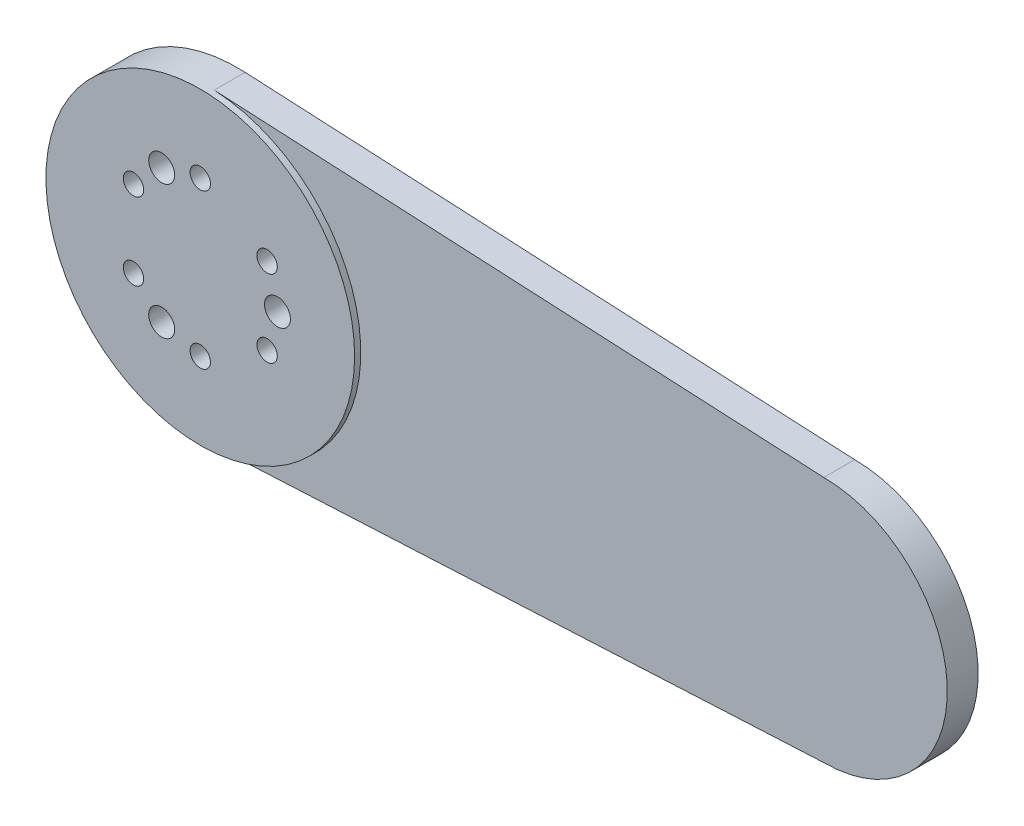
ISO-10303-21;
HEADER;
FILE_DESCRIPTION(('STEP AP214'),'2;1');
FILE_NAME('part.step','',(''),(''),'','','');
FILE_SCHEMA(('AUTOMOTIVE_DESIGN { 1 0 10303 214 1 1 1 1 }'));
ENDSEC;
DATA;
#1=APPLICATION_CONTEXT('core data for automotive mechanical design processes');
#2=APPLICATION_PROTOCOL_DEFINITION('international standard','automotive_design',2000,#1);
#3=PRODUCT_CONTEXT('',#1,'mechanical');
#4=PRODUCT('Part','Part','',(#3));
#5=PRODUCT_RELATED_PRODUCT_CATEGORY('part','',(#4));
#6=PRODUCT_DEFINITION_FORMATION('','',#4);
#7=PRODUCT_DEFINITION_CONTEXT('part definition',#1,'design');
#8=PRODUCT_DEFINITION('design','',#6,#7);
#9=PRODUCT_DEFINITION_SHAPE('','',#8);
#10=(LENGTH_UNIT() NAMED_UNIT(*) SI_UNIT(.MILLI.,.METRE.));
#11=(NAMED_UNIT(*) PLANE_ANGLE_UNIT() SI_UNIT($,.RADIAN.));
#12=(NAMED_UNIT(*) SI_UNIT($,.STERADIAN.) SOLID_ANGLE_UNIT());
#13=UNCERTAINTY_MEASURE_WITH_UNIT(LENGTH_MEASURE(1.E-05),#10,'distance_accuracy_value','');
#14=(GEOMETRIC_REPRESENTATION_CONTEXT(3) GLOBAL_UNCERTAINTY_ASSIGNED_CONTEXT((#13)) GLOBAL_UNIT_ASSIGNED_CONTEXT((#10,
#11,#12)) REPRESENTATION_CONTEXT('',''));
#15=CARTESIAN_POINT('',(0.,0.,0.));
#16=DIRECTION('',(0.,0.,1.));
#17=DIRECTION('',(1.,0.,0.));
#18=AXIS2_PLACEMENT_3D('',#15,#16,#17);
#19=CARTESIAN_POINT('',(100.,0.,3.));
#20=DIRECTION('',(0.,0.,-1.));
#21=DIRECTION('',(-1.,0.,0.));
#22=AXIS2_PLACEMENT_3D('',#19,#20,#21);
#23=CYLINDRICAL_SURFACE('',#22,20.);
#24=CARTESIAN_POINT('',(100.,0.,2.));
#25=DIRECTION('',(0.,0.,1.));
#26=DIRECTION('',(1.,0.,0.));
#27=AXIS2_PLACEMENT_3D('',#24,#25,#26);
#28=CIRCLE('',#27,20.);
#29=CARTESIAN_POINT('',(100.,-20.,2.));
#30=VERTEX_POINT('',#29);
#31=CARTESIAN_POINT('',(100.,20.,2.));
#32=VERTEX_POINT('',#31);
#33=EDGE_CURVE('E179',#30,#32,#28,.T.);
#34=ORIENTED_EDGE('',*,*,#33,.F.);
#35=DIRECTION('',(0.,0.,-1.));
#36=VECTOR('',#35,1.);
#37=CARTESIAN_POINT('',(100.,-20.,3.));
#38=LINE('',#37,#36);
#39=CARTESIAN_POINT('',(100.,-20.,-3.));
#40=VERTEX_POINT('',#39);
#41=EDGE_CURVE('E261',#30,#40,#38,.T.);
#42=ORIENTED_EDGE('',*,*,#41,.T.);
#43=CARTESIAN_POINT('',(100.,0.,-3.));
#44=DIRECTION('',(0.,0.,-1.));
#45=DIRECTION('',(-1.,0.,0.));
#46=AXIS2_PLACEMENT_3D('',#43,#44,#45);
#47=CIRCLE('',#46,20.);
#48=CARTESIAN_POINT('',(100.,20.,-3.));
#49=VERTEX_POINT('',#48);
#50=EDGE_CURVE('E282',#49,#40,#47,.T.);
#51=ORIENTED_EDGE('',*,*,#50,.F.);
#52=DIRECTION('',(0.,0.,-1.));
#53=VECTOR('',#52,1.);
#54=CARTESIAN_POINT('',(100.,20.,3.));
#55=LINE('',#54,#53);
#56=EDGE_CURVE('E79',#32,#49,#55,.T.);
#57=ORIENTED_EDGE('',*,*,#56,.F.);
#58=EDGE_LOOP('',(#34,#42,#51,#57));
#59=FACE_BOUND('',#58,.T.);
#60=ADVANCED_FACE('F71',(#59),#23,.T.);
#61=CARTESIAN_POINT('',(100.,20.,3.));
#62=DIRECTION('',(-0.0502526929491808,-0.998736535254096,0.));
#63=DIRECTION('',(0.998736535254096,-0.0502526929491808,0.));
#64=AXIS2_PLACEMENT_3D('',#61,#62,#63);
#65=PLANE('',#64);
#66=DIRECTION('',(-0.998736535254096,0.0502526929491808,0.));
#67=VECTOR('',#66,1.);
#68=CARTESIAN_POINT('',(100.,20.,2.));
#69=LINE('',#68,#67);
#70=CARTESIAN_POINT('',(1.25631732372952,24.9684133813524,2.));
#71=VERTEX_POINT('',#70);
#72=EDGE_CURVE('E182',#32,#71,#69,.T.);
#73=ORIENTED_EDGE('',*,*,#72,.F.);
#74=ORIENTED_EDGE('',*,*,#56,.T.);
#75=DIRECTION('',(0.998736535254096,-0.0502526929491808,0.));
#76=VECTOR('',#75,1.);
#77=CARTESIAN_POINT('',(1.25631732372951,24.9684133813524,-3.));
#78=LINE('',#77,#76);
#79=CARTESIAN_POINT('',(1.25631732372951,24.9684133813524,-3.));
#80=VERTEX_POINT('',#79);
#81=EDGE_CURVE('E278',#80,#49,#78,.T.);
#82=ORIENTED_EDGE('',*,*,#81,.F.);
#83=DIRECTION('',(0.,0.,-1.));
#84=VECTOR('',#83,1.);
#85=CARTESIAN_POINT('',(1.25631732372952,24.9684133813524,3.));
#86=LINE('',#85,#84);
#87=EDGE_CURVE('E267',#71,#80,#86,.T.);
#88=ORIENTED_EDGE('',*,*,#87,.F.);
#89=EDGE_LOOP('',(#73,#74,#82,#88));
#90=FACE_BOUND('',#89,.T.);
#91=ADVANCED_FACE('F275',(#90),#65,.F.);
#92=CARTESIAN_POINT('',(100.,-20.,3.));
#93=DIRECTION('',(-0.0502526929491809,0.998736535254096,0.));
#94=DIRECTION('',(-0.998736535254096,-0.0502526929491809,0.));
#95=AXIS2_PLACEMENT_3D('',#92,#93,#94);
#96=PLANE('',#95);
#97=DIRECTION('',(0.998736535254096,0.0502526929491809,0.));
#98=VECTOR('',#97,1.);
#99=CARTESIAN_POINT('',(100.,-20.,2.));
#100=LINE('',#99,#98);
#101=CARTESIAN_POINT('',(1.25631732372951,-24.9684133813524,2.));
#102=VERTEX_POINT('',#101);
#103=EDGE_CURVE('E12',#102,#30,#100,.T.);
#104=ORIENTED_EDGE('',*,*,#103,.F.);
#105=DIRECTION('',(0.,0.,-1.));
#106=VECTOR('',#105,1.);
#107=CARTESIAN_POINT('',(1.25631732372951,-24.9684133813524,3.));
#108=LINE('',#107,#106);
#109=CARTESIAN_POINT('',(1.25631732372951,-24.9684133813524,-3.));
#110=VERTEX_POINT('',#109);
#111=EDGE_CURVE('E264',#102,#110,#108,.T.);
#112=ORIENTED_EDGE('',*,*,#111,.T.);
#113=DIRECTION('',(-0.998736535254096,-0.0502526929491808,0.));
#114=VECTOR('',#113,1.);
#115=CARTESIAN_POINT('',(100.,-20.,-3.));
#116=LINE('',#115,#114);
#117=EDGE_CURVE('E288',#40,#110,#116,.T.);
#118=ORIENTED_EDGE('',*,*,#117,.F.);
#119=ORIENTED_EDGE('',*,*,#41,.F.);
#120=EDGE_LOOP('',(#104,#112,#118,#119));
#121=FACE_BOUND('',#120,.T.);
#122=ADVANCED_FACE('F316',(#121),#96,.F.);
#123=CARTESIAN_POINT('',(100.,0.,3.));
#124=DIRECTION('',(0.,0.,1.));
#125=DIRECTION('',(1.,0.,0.));
#126=AXIS2_PLACEMENT_3D('',#123,#124,#125);
#127=PLANE('',#126);
#128=CARTESIAN_POINT('',(0.,0.,3.));
#129=DIRECTION('',(0.,0.,1.));
#130=DIRECTION('',(1.,0.,0.));
#131=AXIS2_PLACEMENT_3D('',#128,#129,#130);
#132=CIRCLE('',#131,25.);
#133=CARTESIAN_POINT('',(25.,0.,3.));
#134=VERTEX_POINT('',#133);
#135=EDGE_CURVE('E254',#134,#134,#132,.T.);
#136=ORIENTED_EDGE('',*,*,#135,.T.);
#137=EDGE_LOOP('',(#136));
#138=FACE_BOUND('',#137,.T.);
#139=CARTESIAN_POINT('',(-6.25000000000005,-10.8253175473055,3.));
#140=DIRECTION('',(0.,0.,1.));
#141=DIRECTION('',(1.,0.,0.));
#142=AXIS2_PLACEMENT_3D('',#139,#140,#141);
#143=CIRCLE('',#142,2.1);
#144=CARTESIAN_POINT('',(-4.15000000000005,-10.8253175473055,3.));
#145=VERTEX_POINT('',#144);
#146=EDGE_CURVE('E194',#145,#145,#143,.T.);
#147=ORIENTED_EDGE('',*,*,#146,.F.);
#148=EDGE_LOOP('',(#147));
#149=FACE_BOUND('',#148,.T.);
#150=CARTESIAN_POINT('',(-10.8253175473055,-6.2499999999999,3.));
#151=DIRECTION('',(0.,0.,1.));
#152=DIRECTION('',(1.,0.,0.));
#153=AXIS2_PLACEMENT_3D('',#150,#151,#152);
#154=CIRCLE('',#153,1.65);
#155=CARTESIAN_POINT('',(-9.17531754730555,-6.2499999999999,3.));
#156=VERTEX_POINT('',#155);
#157=EDGE_CURVE('E210',#156,#156,#154,.T.);
#158=ORIENTED_EDGE('',*,*,#157,.F.);
#159=EDGE_LOOP('',(#158));
#160=FACE_BOUND('',#159,.T.);
#161=CARTESIAN_POINT('',(10.8253175473055,-6.25000000000005,3.));
#162=DIRECTION('',(0.,0.,1.));
#163=DIRECTION('',(1.,0.,0.));
#164=AXIS2_PLACEMENT_3D('',#161,#162,#163);
#165=CIRCLE('',#164,1.65);
#166=CARTESIAN_POINT('',(12.4753175473055,-6.25000000000005,3.));
#167=VERTEX_POINT('',#166);
#168=EDGE_CURVE('E226',#167,#167,#165,.T.);
#169=ORIENTED_EDGE('',*,*,#168,.F.);
#170=EDGE_LOOP('',(#169));
#171=FACE_BOUND('',#170,.T.);
#172=CARTESIAN_POINT('',(12.5,0.,3.));
#173=DIRECTION('',(0.,0.,1.));
#174=DIRECTION('',(1.,0.,0.));
#175=AXIS2_PLACEMENT_3D('',#172,#173,#174);
#176=CIRCLE('',#175,2.1);
#177=CARTESIAN_POINT('',(14.6,0.,3.));
#178=VERTEX_POINT('',#177);
#179=EDGE_CURVE('E242',#178,#178,#176,.T.);
#180=ORIENTED_EDGE('',*,*,#179,.F.);
#181=EDGE_LOOP('',(#180));
#182=FACE_BOUND('',#181,.T.);
#183=CARTESIAN_POINT('',(0.,12.5,3.));
#184=DIRECTION('',(0.,0.,1.));
#185=DIRECTION('',(1.,0.,0.));
#186=AXIS2_PLACEMENT_3D('',#183,#184,#185);
#187=CIRCLE('',#186,1.65);
#188=CARTESIAN_POINT('',(1.65,12.5,3.));
#189=VERTEX_POINT('',#188);
#190=EDGE_CURVE('E250',#189,#189,#187,.T.);
#191=ORIENTED_EDGE('',*,*,#190,.F.);
#192=EDGE_LOOP('',(#191));
#193=FACE_BOUND('',#192,.T.);
#194=CARTESIAN_POINT('',(10.8253175473055,6.24999999999998,3.));
#195=DIRECTION('',(0.,0.,1.));
#196=DIRECTION('',(1.,0.,0.));
#197=AXIS2_PLACEMENT_3D('',#194,#195,#196);
#198=CIRCLE('',#197,1.65);
#199=CARTESIAN_POINT('',(12.4753175473055,6.24999999999998,3.));
#200=VERTEX_POINT('',#199);
#201=EDGE_CURVE('E234',#200,#200,#198,.T.);
#202=ORIENTED_EDGE('',*,*,#201,.F.);
#203=EDGE_LOOP('',(#202));
#204=FACE_BOUND('',#203,.T.);
#205=CARTESIAN_POINT('',(0.,-12.5,3.));
#206=DIRECTION('',(0.,0.,1.));
#207=DIRECTION('',(1.,0.,0.));
#208=AXIS2_PLACEMENT_3D('',#205,#206,#207);
#209=CIRCLE('',#208,1.65);
#210=CARTESIAN_POINT('',(1.64999999999991,-12.5,3.));
#211=VERTEX_POINT('',#210);
#212=EDGE_CURVE('E218',#211,#211,#209,.T.);
#213=ORIENTED_EDGE('',*,*,#212,.F.);
#214=EDGE_LOOP('',(#213));
#215=FACE_BOUND('',#214,.T.);
#216=CARTESIAN_POINT('',(-10.8253175473054,6.25000000000013,3.));
#217=DIRECTION('',(0.,0.,1.));
#218=DIRECTION('',(1.,0.,0.));
#219=AXIS2_PLACEMENT_3D('',#216,#217,#218);
#220=CIRCLE('',#219,1.65);
#221=CARTESIAN_POINT('',(-9.17531754730541,6.25000000000013,3.));
#222=VERTEX_POINT('',#221);
#223=EDGE_CURVE('E202',#222,#222,#220,.T.);
#224=ORIENTED_EDGE('',*,*,#223,.F.);
#225=EDGE_LOOP('',(#224));
#226=FACE_BOUND('',#225,.T.);
#227=CARTESIAN_POINT('',(-6.2499999999999,10.8253175473055,3.));
#228=DIRECTION('',(0.,0.,1.));
#229=DIRECTION('',(1.,0.,0.));
#230=AXIS2_PLACEMENT_3D('',#227,#228,#229);
#231=CIRCLE('',#230,2.1);
#232=CARTESIAN_POINT('',(-4.1499999999999,10.8253175473055,3.));
#233=VERTEX_POINT('',#232);
#234=EDGE_CURVE('E186',#233,#233,#231,.T.);
#235=ORIENTED_EDGE('',*,*,#234,.F.);
#236=EDGE_LOOP('',(#235));
#237=FACE_BOUND('',#236,.T.);
#238=ADVANCED_FACE('F337',(#138,#149,#160,#171,#182,#193,#204,#215,#226,#237),#127,.T.);
#239=CARTESIAN_POINT('',(100.,0.,0.));
#240=DIRECTION('',(0.,0.,1.));
#241=DIRECTION('',(1.,0.,0.));
#242=AXIS2_PLACEMENT_3D('',#239,#240,#241);
#243=PLANE('',#242);
#244=DIRECTION('',(0.998736535254096,-0.0502526929491808,0.));
#245=VECTOR('',#244,1.);
#246=CARTESIAN_POINT('',(1.10555924488198,21.9722037755901,0.));
#247=LINE('',#246,#245);
#248=CARTESIAN_POINT('',(1.10555924488198,21.9722037755901,0.));
#249=VERTEX_POINT('',#248);
#250=CARTESIAN_POINT('',(99.927634419751,16.9998459764433,0.));
#251=VERTEX_POINT('',#250);
#252=EDGE_CURVE('E167',#249,#251,#247,.T.);
#253=ORIENTED_EDGE('',*,*,#252,.T.);
#254=CARTESIAN_POINT('',(100.,0.,0.));
#255=DIRECTION('',(0.,0.,-1.));
#256=DIRECTION('',(-1.,0.,0.));
#257=AXIS2_PLACEMENT_3D('',#254,#255,#256);
#258=CIRCLE('',#257,17.);
#259=CARTESIAN_POINT('',(99.927634419751,-16.9998459764433,0.));
#260=VERTEX_POINT('',#259);
#261=EDGE_CURVE('E142',#251,#260,#258,.T.);
#262=ORIENTED_EDGE('',*,*,#261,.T.);
#263=DIRECTION('',(-0.998736535254096,-0.0502526929491808,0.));
#264=VECTOR('',#263,1.);
#265=CARTESIAN_POINT('',(1.10555924488198,-21.9722037755901,0.));
#266=LINE('',#265,#264);
#267=CARTESIAN_POINT('',(1.10555924488195,-21.9722037755901,0.));
#268=VERTEX_POINT('',#267);
#269=EDGE_CURVE('E170',#260,#268,#266,.T.);
#270=ORIENTED_EDGE('',*,*,#269,.T.);
#271=CARTESIAN_POINT('',(0.,0.,0.));
#272=DIRECTION('',(0.,0.,-1.));
#273=DIRECTION('',(-1.,0.,0.));
#274=AXIS2_PLACEMENT_3D('',#271,#272,#273);
#275=CIRCLE('',#274,22.);
#276=EDGE_CURVE('E302',#268,#249,#275,.T.);
#277=ORIENTED_EDGE('',*,*,#276,.T.);
#278=EDGE_LOOP('',(#253,#262,#270,#277));
#279=FACE_BOUND('',#278,.T.);
#280=CARTESIAN_POINT('',(0.,12.5,0.));
#281=DIRECTION('',(0.,0.,1.));
#282=DIRECTION('',(1.,0.,0.));
#283=AXIS2_PLACEMENT_3D('',#280,#281,#282);
#284=CIRCLE('',#283,1.65);
#285=CARTESIAN_POINT('',(1.65,12.5,0.));
#286=VERTEX_POINT('',#285);
#287=EDGE_CURVE('E246',#286,#286,#284,.T.);
#288=ORIENTED_EDGE('',*,*,#287,.T.);
#289=EDGE_LOOP('',(#288));
#290=FACE_BOUND('',#289,.T.);
#291=CARTESIAN_POINT('',(12.5,0.,0.));
#292=DIRECTION('',(0.,0.,1.));
#293=DIRECTION('',(1.,0.,0.));
#294=AXIS2_PLACEMENT_3D('',#291,#292,#293);
#295=CIRCLE('',#294,2.1);
#296=CARTESIAN_POINT('',(14.6,0.,0.));
#297=VERTEX_POINT('',#296);
#298=EDGE_CURVE('E238',#297,#297,#295,.T.);
#299=ORIENTED_EDGE('',*,*,#298,.T.);
#300=EDGE_LOOP('',(#299));
#301=FACE_BOUND('',#300,.T.);
#302=CARTESIAN_POINT('',(10.8253175473055,6.24999999999998,0.));
#303=DIRECTION('',(0.,0.,1.));
#304=DIRECTION('',(1.,0.,0.));
#305=AXIS2_PLACEMENT_3D('',#302,#303,#304);
#306=CIRCLE('',#305,1.65);
#307=CARTESIAN_POINT('',(12.4753175473055,6.24999999999998,0.));
#308=VERTEX_POINT('',#307);
#309=EDGE_CURVE('E230',#308,#308,#306,.T.);
#310=ORIENTED_EDGE('',*,*,#309,.T.);
#311=EDGE_LOOP('',(#310));
#312=FACE_BOUND('',#311,.T.);
#313=CARTESIAN_POINT('',(10.8253175473055,-6.25000000000005,0.));
#314=DIRECTION('',(0.,0.,1.));
#315=DIRECTION('',(1.,0.,0.));
#316=AXIS2_PLACEMENT_3D('',#313,#314,#315);
#317=CIRCLE('',#316,1.65);
#318=CARTESIAN_POINT('',(12.4753175473055,-6.25000000000005,0.));
#319=VERTEX_POINT('',#318);
#320=EDGE_CURVE('E222',#319,#319,#317,.T.);
#321=ORIENTED_EDGE('',*,*,#320,.T.);
#322=EDGE_LOOP('',(#321));
#323=FACE_BOUND('',#322,.T.);
#324=CARTESIAN_POINT('',(0.,-12.5,0.));
#325=DIRECTION('',(0.,0.,1.));
#326=DIRECTION('',(1.,0.,0.));
#327=AXIS2_PLACEMENT_3D('',#324,#325,#326);
#328=CIRCLE('',#327,1.65);
#329=CARTESIAN_POINT('',(1.64999999999991,-12.5,0.));
#330=VERTEX_POINT('',#329);
#331=EDGE_CURVE('E214',#330,#330,#328,.T.);
#332=ORIENTED_EDGE('',*,*,#331,.T.);
#333=EDGE_LOOP('',(#332));
#334=FACE_BOUND('',#333,.T.);
#335=CARTESIAN_POINT('',(-10.8253175473055,-6.2499999999999,0.));
#336=DIRECTION('',(0.,0.,1.));
#337=DIRECTION('',(1.,0.,0.));
#338=AXIS2_PLACEMENT_3D('',#335,#336,#337);
#339=CIRCLE('',#338,1.65);
#340=CARTESIAN_POINT('',(-9.17531754730555,-6.2499999999999,0.));
#341=VERTEX_POINT('',#340);
#342=EDGE_CURVE('E206',#341,#341,#339,.T.);
#343=ORIENTED_EDGE('',*,*,#342,.T.);
#344=EDGE_LOOP('',(#343));
#345=FACE_BOUND('',#344,.T.);
#346=CARTESIAN_POINT('',(-10.8253175473054,6.25000000000013,0.));
#347=DIRECTION('',(0.,0.,1.));
#348=DIRECTION('',(1.,0.,0.));
#349=AXIS2_PLACEMENT_3D('',#346,#347,#348);
#350=CIRCLE('',#349,1.65);
#351=CARTESIAN_POINT('',(-9.17531754730541,6.25000000000013,0.));
#352=VERTEX_POINT('',#351);
#353=EDGE_CURVE('E198',#352,#352,#350,.T.);
#354=ORIENTED_EDGE('',*,*,#353,.T.);
#355=EDGE_LOOP('',(#354));
#356=FACE_BOUND('',#355,.T.);
#357=CARTESIAN_POINT('',(-6.25000000000005,-10.8253175473055,0.));
#358=DIRECTION('',(0.,0.,1.));
#359=DIRECTION('',(1.,0.,0.));
#360=AXIS2_PLACEMENT_3D('',#357,#358,#359);
#361=CIRCLE('',#360,2.1);
#362=CARTESIAN_POINT('',(-4.15000000000005,-10.8253175473055,0.));
#363=VERTEX_POINT('',#362);
#364=EDGE_CURVE('E190',#363,#363,#361,.T.);
#365=ORIENTED_EDGE('',*,*,#364,.T.);
#366=EDGE_LOOP('',(#365));
#367=FACE_BOUND('',#366,.T.);
#368=CARTESIAN_POINT('',(-6.2499999999999,10.8253175473055,0.));
#369=DIRECTION('',(0.,0.,1.));
#370=DIRECTION('',(1.,0.,0.));
#371=AXIS2_PLACEMENT_3D('',#368,#369,#370);
#372=CIRCLE('',#371,2.1);
#373=CARTESIAN_POINT('',(-4.1499999999999,10.8253175473055,0.));
#374=VERTEX_POINT('',#373);
#375=EDGE_CURVE('E185',#374,#374,#372,.T.);
#376=ORIENTED_EDGE('',*,*,#375,.T.);
#377=EDGE_LOOP('',(#376));
#378=FACE_BOUND('',#377,.T.);
#379=ADVANCED_FACE('F342',(#279,#290,#301,#312,#323,#334,#345,#356,#367,#378),#243,.F.);
#380=CARTESIAN_POINT('',(0.,0.,3.));
#381=DIRECTION('',(0.,0.,-1.));
#382=DIRECTION('',(-1.,0.,0.));
#383=AXIS2_PLACEMENT_3D('',#380,#381,#382);
#384=CYLINDRICAL_SURFACE('',#383,25.);
#385=CARTESIAN_POINT('',(0.,0.,2.));
#386=DIRECTION('',(0.,0.,-1.));
#387=DIRECTION('',(1.,0.,0.));
#388=AXIS2_PLACEMENT_3D('',#385,#386,#387);
#389=CIRCLE('',#388,25.);
#390=EDGE_CURVE('E93',#71,#102,#389,.T.);
#391=ORIENTED_EDGE('',*,*,#390,.F.);
#392=ORIENTED_EDGE('',*,*,#87,.T.);
#393=CARTESIAN_POINT('',(0.,0.,-3.));
#394=DIRECTION('',(0.,0.,-1.));
#395=DIRECTION('',(-1.,0.,0.));
#396=AXIS2_PLACEMENT_3D('',#393,#394,#395);
#397=CIRCLE('',#396,25.);
#398=EDGE_CURVE('E292',#110,#80,#397,.T.);
#399=ORIENTED_EDGE('',*,*,#398,.F.);
#400=ORIENTED_EDGE('',*,*,#111,.F.);
#401=EDGE_LOOP('',(#391,#392,#399,#400));
#402=FACE_BOUND('',#401,.T.);
#403=ORIENTED_EDGE('',*,*,#135,.F.);
#404=EDGE_LOOP('',(#403));
#405=FACE_BOUND('',#404,.T.);
#406=ADVANCED_FACE('F314',(#402,#405),#384,.T.);
#407=CARTESIAN_POINT('',(0.,12.5,3.));
#408=DIRECTION('',(0.,0.,-1.));
#409=DIRECTION('',(-1.,0.,0.));
#410=AXIS2_PLACEMENT_3D('',#407,#408,#409);
#411=CYLINDRICAL_SURFACE('',#410,1.65);
#412=ORIENTED_EDGE('',*,*,#190,.T.);
#413=EDGE_LOOP('',(#412));
#414=FACE_BOUND('',#413,.T.);
#415=ORIENTED_EDGE('',*,*,#287,.F.);
#416=EDGE_LOOP('',(#415));
#417=FACE_BOUND('',#416,.T.);
#418=ADVANCED_FACE('F341',(#414,#417),#411,.F.);
#419=CARTESIAN_POINT('',(12.5,0.,3.));
#420=DIRECTION('',(0.,0.,-1.));
#421=DIRECTION('',(-1.,0.,0.));
#422=AXIS2_PLACEMENT_3D('',#419,#420,#421);
#423=CYLINDRICAL_SURFACE('',#422,2.1);
#424=ORIENTED_EDGE('',*,*,#179,.T.);
#425=EDGE_LOOP('',(#424));
#426=FACE_BOUND('',#425,.T.);
#427=ORIENTED_EDGE('',*,*,#298,.F.);
#428=EDGE_LOOP('',(#427));
#429=FACE_BOUND('',#428,.T.);
#430=ADVANCED_FACE('F350',(#426,#429),#423,.F.);
#431=CARTESIAN_POINT('',(10.8253175473055,6.24999999999998,3.));
#432=DIRECTION('',(0.,0.,-1.));
#433=DIRECTION('',(-1.,0.,0.));
#434=AXIS2_PLACEMENT_3D('',#431,#432,#433);
#435=CYLINDRICAL_SURFACE('',#434,1.65);
#436=ORIENTED_EDGE('',*,*,#201,.T.);
#437=EDGE_LOOP('',(#436));
#438=FACE_BOUND('',#437,.T.);
#439=ORIENTED_EDGE('',*,*,#309,.F.);
#440=EDGE_LOOP('',(#439));
#441=FACE_BOUND('',#440,.T.);
#442=ADVANCED_FACE('F354',(#438,#441),#435,.F.);
#443=CARTESIAN_POINT('',(10.8253175473055,-6.25000000000005,3.));
#444=DIRECTION('',(0.,0.,-1.));
#445=DIRECTION('',(-1.,0.,0.));
#446=AXIS2_PLACEMENT_3D('',#443,#444,#445);
#447=CYLINDRICAL_SURFACE('',#446,1.65);
#448=ORIENTED_EDGE('',*,*,#168,.T.);
#449=EDGE_LOOP('',(#448));
#450=FACE_BOUND('',#449,.T.);
#451=ORIENTED_EDGE('',*,*,#320,.F.);
#452=EDGE_LOOP('',(#451));
#453=FACE_BOUND('',#452,.T.);
#454=ADVANCED_FACE('F358',(#450,#453),#447,.F.);
#455=CARTESIAN_POINT('',(0.,-12.5,3.));
#456=DIRECTION('',(0.,0.,-1.));
#457=DIRECTION('',(-1.,0.,0.));
#458=AXIS2_PLACEMENT_3D('',#455,#456,#457);
#459=CYLINDRICAL_SURFACE('',#458,1.65);
#460=ORIENTED_EDGE('',*,*,#212,.T.);
#461=EDGE_LOOP('',(#460));
#462=FACE_BOUND('',#461,.T.);
#463=ORIENTED_EDGE('',*,*,#331,.F.);
#464=EDGE_LOOP('',(#463));
#465=FACE_BOUND('',#464,.T.);
#466=ADVANCED_FACE('F362',(#462,#465),#459,.F.);
#467=CARTESIAN_POINT('',(-10.8253175473055,-6.2499999999999,3.));
#468=DIRECTION('',(0.,0.,-1.));
#469=DIRECTION('',(-1.,0.,0.));
#470=AXIS2_PLACEMENT_3D('',#467,#468,#469);
#471=CYLINDRICAL_SURFACE('',#470,1.65);
#472=ORIENTED_EDGE('',*,*,#157,.T.);
#473=EDGE_LOOP('',(#472));
#474=FACE_BOUND('',#473,.T.);
#475=ORIENTED_EDGE('',*,*,#342,.F.);
#476=EDGE_LOOP('',(#475));
#477=FACE_BOUND('',#476,.T.);
#478=ADVANCED_FACE('F366',(#474,#477),#471,.F.);
#479=CARTESIAN_POINT('',(-10.8253175473054,6.25000000000013,3.));
#480=DIRECTION('',(0.,0.,-1.));
#481=DIRECTION('',(-1.,0.,0.));
#482=AXIS2_PLACEMENT_3D('',#479,#480,#481);
#483=CYLINDRICAL_SURFACE('',#482,1.65);
#484=ORIENTED_EDGE('',*,*,#223,.T.);
#485=EDGE_LOOP('',(#484));
#486=FACE_BOUND('',#485,.T.);
#487=ORIENTED_EDGE('',*,*,#353,.F.);
#488=EDGE_LOOP('',(#487));
#489=FACE_BOUND('',#488,.T.);
#490=ADVANCED_FACE('F370',(#486,#489),#483,.F.);
#491=CARTESIAN_POINT('',(-6.25000000000005,-10.8253175473055,3.));
#492=DIRECTION('',(0.,0.,-1.));
#493=DIRECTION('',(-1.,0.,0.));
#494=AXIS2_PLACEMENT_3D('',#491,#492,#493);
#495=CYLINDRICAL_SURFACE('',#494,2.1);
#496=ORIENTED_EDGE('',*,*,#146,.T.);
#497=EDGE_LOOP('',(#496));
#498=FACE_BOUND('',#497,.T.);
#499=ORIENTED_EDGE('',*,*,#364,.F.);
#500=EDGE_LOOP('',(#499));
#501=FACE_BOUND('',#500,.T.);
#502=ADVANCED_FACE('F328',(#498,#501),#495,.F.);
#503=CARTESIAN_POINT('',(-6.2499999999999,10.8253175473055,3.));
#504=DIRECTION('',(0.,0.,-1.));
#505=DIRECTION('',(-1.,0.,0.));
#506=AXIS2_PLACEMENT_3D('',#503,#504,#505);
#507=CYLINDRICAL_SURFACE('',#506,2.1);
#508=ORIENTED_EDGE('',*,*,#234,.T.);
#509=EDGE_LOOP('',(#508));
#510=FACE_BOUND('',#509,.T.);
#511=ORIENTED_EDGE('',*,*,#375,.F.);
#512=EDGE_LOOP('',(#511));
#513=FACE_BOUND('',#512,.T.);
#514=ADVANCED_FACE('F319',(#510,#513),#507,.F.);
#515=CARTESIAN_POINT('',(0.,0.,2.));
#516=DIRECTION('',(0.,0.,1.));
#517=DIRECTION('',(1.,0.,0.));
#518=AXIS2_PLACEMENT_3D('',#515,#516,#517);
#519=PLANE('',#518);
#520=ORIENTED_EDGE('',*,*,#72,.T.);
#521=ORIENTED_EDGE('',*,*,#390,.T.);
#522=ORIENTED_EDGE('',*,*,#103,.T.);
#523=ORIENTED_EDGE('',*,*,#33,.T.);
#524=EDGE_LOOP('',(#520,#521,#522,#523));
#525=FACE_BOUND('',#524,.T.);
#526=ADVANCED_FACE('F317',(#525),#519,.T.);
#527=CARTESIAN_POINT('',(100.,0.,-3.));
#528=DIRECTION('',(0.,0.,-1.));
#529=DIRECTION('',(-1.,0.,0.));
#530=AXIS2_PLACEMENT_3D('',#527,#528,#529);
#531=PLANE('',#530);
#532=ORIENTED_EDGE('',*,*,#81,.T.);
#533=ORIENTED_EDGE('',*,*,#50,.T.);
#534=ORIENTED_EDGE('',*,*,#117,.T.);
#535=ORIENTED_EDGE('',*,*,#398,.T.);
#536=EDGE_LOOP('',(#532,#533,#534,#535));
#537=FACE_BOUND('',#536,.T.);
#538=CARTESIAN_POINT('',(0.,0.,-3.));
#539=DIRECTION('',(0.,0.,-1.));
#540=DIRECTION('',(-1.,0.,0.));
#541=AXIS2_PLACEMENT_3D('',#538,#539,#540);
#542=CIRCLE('',#541,22.);
#543=CARTESIAN_POINT('',(1.10555924488195,-21.9722037755901,-3.));
#544=VERTEX_POINT('',#543);
#545=CARTESIAN_POINT('',(1.10555924488198,21.9722037755901,-3.));
#546=VERTEX_POINT('',#545);
#547=EDGE_CURVE('E147',#544,#546,#542,.T.);
#548=ORIENTED_EDGE('',*,*,#547,.F.);
#549=DIRECTION('',(-0.998736535254096,-0.0502526929491808,0.));
#550=VECTOR('',#549,1.);
#551=CARTESIAN_POINT('',(1.10555924488198,-21.9722037755901,-3.));
#552=LINE('',#551,#550);
#553=CARTESIAN_POINT('',(99.927634419751,-16.9998459764433,-3.));
#554=VERTEX_POINT('',#553);
#555=EDGE_CURVE('E161',#554,#544,#552,.T.);
#556=ORIENTED_EDGE('',*,*,#555,.F.);
#557=CARTESIAN_POINT('',(100.,0.,-3.));
#558=DIRECTION('',(0.,0.,-1.));
#559=DIRECTION('',(-1.,0.,0.));
#560=AXIS2_PLACEMENT_3D('',#557,#558,#559);
#561=CIRCLE('',#560,17.);
#562=CARTESIAN_POINT('',(99.927634419751,16.9998459764433,-3.));
#563=VERTEX_POINT('',#562);
#564=EDGE_CURVE('E139',#563,#554,#561,.T.);
#565=ORIENTED_EDGE('',*,*,#564,.F.);
#566=DIRECTION('',(0.998736535254096,-0.0502526929491808,0.));
#567=VECTOR('',#566,1.);
#568=CARTESIAN_POINT('',(1.10555924488198,21.9722037755901,-3.));
#569=LINE('',#568,#567);
#570=EDGE_CURVE('E148',#546,#563,#569,.T.);
#571=ORIENTED_EDGE('',*,*,#570,.F.);
#572=EDGE_LOOP('',(#548,#556,#565,#571));
#573=FACE_BOUND('',#572,.T.);
#574=ADVANCED_FACE('F160',(#537,#573),#531,.T.);
#575=CARTESIAN_POINT('',(100.,0.,-3.));
#576=DIRECTION('',(0.,0.,1.));
#577=DIRECTION('',(1.,0.,0.));
#578=AXIS2_PLACEMENT_3D('',#575,#576,#577);
#579=CYLINDRICAL_SURFACE('',#578,17.);
#580=ORIENTED_EDGE('',*,*,#261,.F.);
#581=DIRECTION('',(0.,0.,1.));
#582=VECTOR('',#581,1.);
#583=CARTESIAN_POINT('',(99.927634419751,16.9998459764433,-3.));
#584=LINE('',#583,#582);
#585=EDGE_CURVE('E134',#563,#251,#584,.T.);
#586=ORIENTED_EDGE('',*,*,#585,.F.);
#587=ORIENTED_EDGE('',*,*,#564,.T.);
#588=DIRECTION('',(0.,0.,1.));
#589=VECTOR('',#588,1.);
#590=CARTESIAN_POINT('',(99.927634419751,-16.9998459764433,-3.));
#591=LINE('',#590,#589);
#592=EDGE_CURVE('E157',#554,#260,#591,.T.);
#593=ORIENTED_EDGE('',*,*,#592,.T.);
#594=EDGE_LOOP('',(#580,#586,#587,#593));
#595=FACE_BOUND('',#594,.T.);
#596=ADVANCED_FACE('F136',(#595),#579,.F.);
#597=CARTESIAN_POINT('',(1.10555924488198,21.9722037755901,-3.));
#598=DIRECTION('',(-0.0502526929491807,-0.998736535254096,0.));
#599=DIRECTION('',(0.998736535254096,-0.0502526929491808,0.));
#600=AXIS2_PLACEMENT_3D('',#597,#598,#599);
#601=PLANE('',#600);
#602=ORIENTED_EDGE('',*,*,#252,.F.);
#603=DIRECTION('',(0.,0.,1.));
#604=VECTOR('',#603,1.);
#605=CARTESIAN_POINT('',(1.10555924488198,21.9722037755901,-3.));
#606=LINE('',#605,#604);
#607=EDGE_CURVE('E153',#546,#249,#606,.T.);
#608=ORIENTED_EDGE('',*,*,#607,.F.);
#609=ORIENTED_EDGE('',*,*,#570,.T.);
#610=ORIENTED_EDGE('',*,*,#585,.T.);
#611=EDGE_LOOP('',(#602,#608,#609,#610));
#612=FACE_BOUND('',#611,.T.);
#613=ADVANCED_FACE('F152',(#612),#601,.T.);
#614=CARTESIAN_POINT('',(0.,0.,-3.));
#615=DIRECTION('',(0.,0.,1.));
#616=DIRECTION('',(1.,0.,0.));
#617=AXIS2_PLACEMENT_3D('',#614,#615,#616);
#618=CYLINDRICAL_SURFACE('',#617,22.);
#619=ORIENTED_EDGE('',*,*,#276,.F.);
#620=DIRECTION('',(0.,0.,1.));
#621=VECTOR('',#620,1.);
#622=CARTESIAN_POINT('',(1.10555924488195,-21.9722037755901,-3.));
#623=LINE('',#622,#621);
#624=EDGE_CURVE('E86',#544,#268,#623,.T.);
#625=ORIENTED_EDGE('',*,*,#624,.F.);
#626=ORIENTED_EDGE('',*,*,#547,.T.);
#627=ORIENTED_EDGE('',*,*,#607,.T.);
#628=EDGE_LOOP('',(#619,#625,#626,#627));
#629=FACE_BOUND('',#628,.T.);
#630=ADVANCED_FACE('F540',(#629),#618,.F.);
#631=CARTESIAN_POINT('',(1.10555924488198,-21.9722037755901,-3.));
#632=DIRECTION('',(-0.0502526929491808,0.998736535254096,0.));
#633=DIRECTION('',(-0.998736535254096,-0.0502526929491808,0.));
#634=AXIS2_PLACEMENT_3D('',#631,#632,#633);
#635=PLANE('',#634);
#636=ORIENTED_EDGE('',*,*,#269,.F.);
#637=ORIENTED_EDGE('',*,*,#592,.F.);
#638=ORIENTED_EDGE('',*,*,#555,.T.);
#639=ORIENTED_EDGE('',*,*,#624,.T.);
#640=EDGE_LOOP('',(#636,#637,#638,#639));
#641=FACE_BOUND('',#640,.T.);
#642=ADVANCED_FACE('F548',(#641),#635,.T.);
#643=CLOSED_SHELL('',(#60,#91,#122,#238,#379,#406,#418,#430,#442,#454,#466,#478,#490,#502,#514,
#526,#574,#596,#613,#630,#642));
#644=MANIFOLD_SOLID_BREP('B2',#643);
#645=ADVANCED_BREP_SHAPE_REPRESENTATION('',(#18,#644),#14);
#646=SHAPE_DEFINITION_REPRESENTATION(#9,#645);
ENDSEC;
END-ISO-10303-21;
